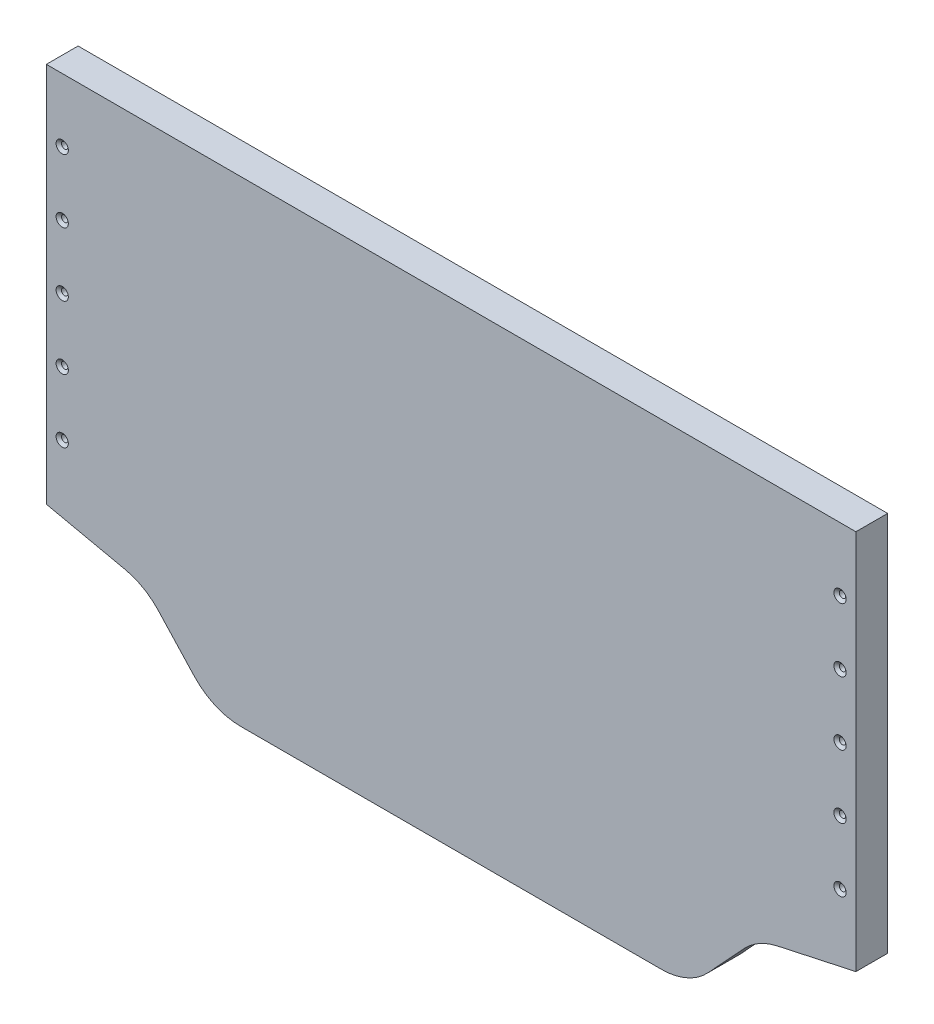
ISO-10303-21;
HEADER;
FILE_DESCRIPTION(('STEP AP214'),'2;1');
FILE_NAME('part.step','',(''),(''),'','','');
FILE_SCHEMA(('AUTOMOTIVE_DESIGN { 1 0 10303 214 1 1 1 1 }'));
ENDSEC;
DATA;
#1=APPLICATION_CONTEXT('core data for automotive mechanical design processes');
#2=APPLICATION_PROTOCOL_DEFINITION('international standard','automotive_design',2000,#1);
#3=PRODUCT_CONTEXT('',#1,'mechanical');
#4=PRODUCT('Part','Part','',(#3));
#5=PRODUCT_RELATED_PRODUCT_CATEGORY('part','',(#4));
#6=PRODUCT_DEFINITION_FORMATION('','',#4);
#7=PRODUCT_DEFINITION_CONTEXT('part definition',#1,'design');
#8=PRODUCT_DEFINITION('design','',#6,#7);
#9=PRODUCT_DEFINITION_SHAPE('','',#8);
#10=(LENGTH_UNIT() NAMED_UNIT(*) SI_UNIT(.MILLI.,.METRE.));
#11=(NAMED_UNIT(*) PLANE_ANGLE_UNIT() SI_UNIT($,.RADIAN.));
#12=(NAMED_UNIT(*) SI_UNIT($,.STERADIAN.) SOLID_ANGLE_UNIT());
#13=UNCERTAINTY_MEASURE_WITH_UNIT(LENGTH_MEASURE(1.E-05),#10,'distance_accuracy_value','');
#14=(GEOMETRIC_REPRESENTATION_CONTEXT(3) GLOBAL_UNCERTAINTY_ASSIGNED_CONTEXT((#13)) GLOBAL_UNIT_ASSIGNED_CONTEXT((#10,
#11,#12)) REPRESENTATION_CONTEXT('',''));
#15=CARTESIAN_POINT('',(0.,0.,0.));
#16=DIRECTION('',(0.,0.,1.));
#17=DIRECTION('',(1.,0.,0.));
#18=AXIS2_PLACEMENT_3D('',#15,#16,#17);
#19=CARTESIAN_POINT('',(-323.85,76.2,25.4));
#20=DIRECTION('',(1.,0.,0.));
#21=DIRECTION('',(0.,0.,-1.));
#22=AXIS2_PLACEMENT_3D('',#19,#20,#21);
#23=PLANE('',#22);
#24=DIRECTION('',(0.,-1.,0.));
#25=VECTOR('',#24,1.);
#26=CARTESIAN_POINT('',(-323.85,76.2,0.));
#27=LINE('',#26,#25);
#28=CARTESIAN_POINT('',(-323.85,381.,0.));
#29=VERTEX_POINT('',#28);
#30=CARTESIAN_POINT('',(-323.85,76.2,0.));
#31=VERTEX_POINT('',#30);
#32=EDGE_CURVE('E147',#29,#31,#27,.T.);
#33=ORIENTED_EDGE('',*,*,#32,.T.);
#34=DIRECTION('',(0.,0.,-1.));
#35=VECTOR('',#34,1.);
#36=CARTESIAN_POINT('',(-323.85,76.2,25.4));
#37=LINE('',#36,#35);
#38=CARTESIAN_POINT('',(-323.85,76.2,25.4));
#39=VERTEX_POINT('',#38);
#40=EDGE_CURVE('E129',#39,#31,#37,.T.);
#41=ORIENTED_EDGE('',*,*,#40,.F.);
#42=DIRECTION('',(0.,-1.,0.));
#43=VECTOR('',#42,1.);
#44=CARTESIAN_POINT('',(-323.85,76.2,25.4));
#45=LINE('',#44,#43);
#46=CARTESIAN_POINT('',(-323.85,381.,25.4));
#47=VERTEX_POINT('',#46);
#48=EDGE_CURVE('E134',#47,#39,#45,.T.);
#49=ORIENTED_EDGE('',*,*,#48,.F.);
#50=DIRECTION('',(0.,0.,-1.));
#51=VECTOR('',#50,1.);
#52=CARTESIAN_POINT('',(-323.85,381.,25.4));
#53=LINE('',#52,#51);
#54=EDGE_CURVE('E282',#47,#29,#53,.T.);
#55=ORIENTED_EDGE('',*,*,#54,.T.);
#56=EDGE_LOOP('',(#33,#41,#49,#55));
#57=FACE_BOUND('',#56,.T.);
#58=ADVANCED_FACE('F34',(#57),#23,.F.);
#59=CARTESIAN_POINT('',(-245.162116143711,59.1225467485061,25.4));
#60=DIRECTION('',(0.212090367220507,0.977250058138791,0.));
#61=DIRECTION('',(-0.977250058138791,0.212090367220507,0.));
#62=AXIS2_PLACEMENT_3D('',#59,#60,#61);
#63=PLANE('',#62);
#64=DIRECTION('',(0.977250058138791,-0.212090367220507,0.));
#65=VECTOR('',#64,1.);
#66=CARTESIAN_POINT('',(-245.162116143711,59.1225467485061,0.));
#67=LINE('',#66,#65);
#68=CARTESIAN_POINT('',(-260.814904739675,62.5196360131163,0.));
#69=VERTEX_POINT('',#68);
#70=EDGE_CURVE('E284',#31,#69,#67,.T.);
#71=ORIENTED_EDGE('',*,*,#70,.T.);
#72=DIRECTION('',(0.,0.,-1.));
#73=VECTOR('',#72,1.);
#74=CARTESIAN_POINT('',(-260.814904739675,62.5196360131163,25.4));
#75=LINE('',#74,#73);
#76=CARTESIAN_POINT('',(-260.814904739675,62.5196360131163,25.4));
#77=VERTEX_POINT('',#76);
#78=EDGE_CURVE('E132',#69,#77,#75,.F.);
#79=ORIENTED_EDGE('',*,*,#78,.T.);
#80=DIRECTION('',(0.977250058138791,-0.212090367220507,0.));
#81=VECTOR('',#80,1.);
#82=CARTESIAN_POINT('',(-245.162116143711,59.1225467485061,25.4));
#83=LINE('',#82,#81);
#84=EDGE_CURVE('E124',#39,#77,#83,.T.);
#85=ORIENTED_EDGE('',*,*,#84,.F.);
#86=ORIENTED_EDGE('',*,*,#40,.T.);
#87=EDGE_LOOP('',(#71,#79,#85,#86));
#88=FACE_BOUND('',#87,.T.);
#89=ADVANCED_FACE('F127',(#88),#63,.F.);
#90=CARTESIAN_POINT('',(-245.162116143711,59.1225467485061,25.4));
#91=DIRECTION('',(0.734261863653778,0.678866345891207,0.));
#92=DIRECTION('',(-0.678866345891207,0.734261863653778,0.));
#93=AXIS2_PLACEMENT_3D('',#90,#91,#92);
#94=PLANE('',#93);
#95=DIRECTION('',(0.678866345891207,-0.734261863653778,0.));
#96=VECTOR('',#95,1.);
#97=CARTESIAN_POINT('',(-245.162116143711,59.1225467485061,0.));
#98=LINE('',#97,#96);
#99=CARTESIAN_POINT('',(-234.288592720865,47.361743430939,0.));
#100=VERTEX_POINT('',#99);
#101=CARTESIAN_POINT('',(-205.582830156142,16.3135896287267,0.));
#102=VERTEX_POINT('',#101);
#103=EDGE_CURVE('E286',#100,#102,#98,.T.);
#104=ORIENTED_EDGE('',*,*,#103,.T.);
#105=DIRECTION('',(0.,0.,-1.));
#106=VECTOR('',#105,1.);
#107=CARTESIAN_POINT('',(-205.582830156142,16.3135896287267,25.4));
#108=LINE('',#107,#106);
#109=CARTESIAN_POINT('',(-205.582830156142,16.3135896287267,25.4));
#110=VERTEX_POINT('',#109);
#111=EDGE_CURVE('E51',#102,#110,#108,.F.);
#112=ORIENTED_EDGE('',*,*,#111,.T.);
#113=DIRECTION('',(0.678866345891207,-0.734261863653778,0.));
#114=VECTOR('',#113,1.);
#115=CARTESIAN_POINT('',(-245.162116143711,59.1225467485061,25.4));
#116=LINE('',#115,#114);
#117=CARTESIAN_POINT('',(-234.288592720865,47.361743430939,25.4));
#118=VERTEX_POINT('',#117);
#119=EDGE_CURVE('E133',#118,#110,#116,.T.);
#120=ORIENTED_EDGE('',*,*,#119,.F.);
#121=DIRECTION('',(0.,0.,-1.));
#122=VECTOR('',#121,1.);
#123=CARTESIAN_POINT('',(-234.288592720865,47.361743430939,0.));
#124=LINE('',#123,#122);
#125=EDGE_CURVE('E176',#118,#100,#124,.T.);
#126=ORIENTED_EDGE('',*,*,#125,.T.);
#127=EDGE_LOOP('',(#104,#112,#120,#126));
#128=FACE_BOUND('',#127,.T.);
#129=ADVANCED_FACE('F314',(#128),#94,.F.);
#130=CARTESIAN_POINT('',(-190.5,0.,25.4));
#131=DIRECTION('',(0.,1.,0.));
#132=DIRECTION('',(-1.,0.,0.));
#133=AXIS2_PLACEMENT_3D('',#130,#131,#132);
#134=PLANE('',#133);
#135=DIRECTION('',(1.,0.,0.));
#136=VECTOR('',#135,1.);
#137=CARTESIAN_POINT('',(-190.5,0.,0.));
#138=LINE('',#137,#136);
#139=CARTESIAN_POINT('',(-168.28232748253,0.,0.));
#140=VERTEX_POINT('',#139);
#141=CARTESIAN_POINT('',(168.28232748253,0.,0.));
#142=VERTEX_POINT('',#141);
#143=EDGE_CURVE('E288',#140,#142,#138,.T.);
#144=ORIENTED_EDGE('',*,*,#143,.T.);
#145=DIRECTION('',(0.,0.,-1.));
#146=VECTOR('',#145,1.);
#147=CARTESIAN_POINT('',(168.28232748253,0.,25.4));
#148=LINE('',#147,#146);
#149=CARTESIAN_POINT('',(168.28232748253,0.,25.4));
#150=VERTEX_POINT('',#149);
#151=EDGE_CURVE('E170',#142,#150,#148,.F.);
#152=ORIENTED_EDGE('',*,*,#151,.T.);
#153=DIRECTION('',(1.,0.,0.));
#154=VECTOR('',#153,1.);
#155=CARTESIAN_POINT('',(-190.5,0.,25.4));
#156=LINE('',#155,#154);
#157=CARTESIAN_POINT('',(-168.28232748253,0.,25.4));
#158=VERTEX_POINT('',#157);
#159=EDGE_CURVE('E272',#158,#150,#156,.T.);
#160=ORIENTED_EDGE('',*,*,#159,.F.);
#161=DIRECTION('',(0.,0.,-1.));
#162=VECTOR('',#161,1.);
#163=CARTESIAN_POINT('',(-168.28232748253,0.,25.4));
#164=LINE('',#163,#162);
#165=EDGE_CURVE('E167',#158,#140,#164,.T.);
#166=ORIENTED_EDGE('',*,*,#165,.T.);
#167=EDGE_LOOP('',(#144,#152,#160,#166));
#168=FACE_BOUND('',#167,.T.);
#169=ADVANCED_FACE('F322',(#168),#134,.F.);
#170=CARTESIAN_POINT('',(245.162116143711,59.1225467485061,25.4));
#171=DIRECTION('',(-0.734261863653778,0.678866345891207,0.));
#172=DIRECTION('',(-0.678866345891207,-0.734261863653778,0.));
#173=AXIS2_PLACEMENT_3D('',#170,#171,#172);
#174=PLANE('',#173);
#175=DIRECTION('',(0.678866345891207,0.734261863653778,0.));
#176=VECTOR('',#175,1.);
#177=CARTESIAN_POINT('',(245.162116143711,59.1225467485061,0.));
#178=LINE('',#177,#176);
#179=CARTESIAN_POINT('',(205.582830156142,16.3135896287267,0.));
#180=VERTEX_POINT('',#179);
#181=CARTESIAN_POINT('',(234.288592720865,47.361743430939,0.));
#182=VERTEX_POINT('',#181);
#183=EDGE_CURVE('E291',#180,#182,#178,.T.);
#184=ORIENTED_EDGE('',*,*,#183,.T.);
#185=DIRECTION('',(0.,0.,-1.));
#186=VECTOR('',#185,1.);
#187=CARTESIAN_POINT('',(234.288592720865,47.361743430939,25.4));
#188=LINE('',#187,#186);
#189=CARTESIAN_POINT('',(234.288592720865,47.361743430939,25.4));
#190=VERTEX_POINT('',#189);
#191=EDGE_CURVE('E161',#182,#190,#188,.F.);
#192=ORIENTED_EDGE('',*,*,#191,.T.);
#193=DIRECTION('',(0.678866345891207,0.734261863653778,0.));
#194=VECTOR('',#193,1.);
#195=CARTESIAN_POINT('',(245.162116143711,59.1225467485061,25.4));
#196=LINE('',#195,#194);
#197=CARTESIAN_POINT('',(205.582830156142,16.3135896287267,25.4));
#198=VERTEX_POINT('',#197);
#199=EDGE_CURVE('E274',#198,#190,#196,.T.);
#200=ORIENTED_EDGE('',*,*,#199,.F.);
#201=DIRECTION('',(0.,0.,-1.));
#202=VECTOR('',#201,1.);
#203=CARTESIAN_POINT('',(205.582830156142,16.3135896287267,25.4));
#204=LINE('',#203,#202);
#205=EDGE_CURVE('E152',#198,#180,#204,.T.);
#206=ORIENTED_EDGE('',*,*,#205,.T.);
#207=EDGE_LOOP('',(#184,#192,#200,#206));
#208=FACE_BOUND('',#207,.T.);
#209=ADVANCED_FACE('F330',(#208),#174,.F.);
#210=CARTESIAN_POINT('',(245.162116143711,59.1225467485061,25.4));
#211=DIRECTION('',(-0.212090367220507,0.977250058138791,0.));
#212=DIRECTION('',(-0.977250058138791,-0.212090367220507,0.));
#213=AXIS2_PLACEMENT_3D('',#210,#211,#212);
#214=PLANE('',#213);
#215=DIRECTION('',(0.977250058138791,0.212090367220507,0.));
#216=VECTOR('',#215,1.);
#217=CARTESIAN_POINT('',(245.162116143711,59.1225467485061,25.4));
#218=LINE('',#217,#216);
#219=CARTESIAN_POINT('',(260.814904739675,62.5196360131163,25.4));
#220=VERTEX_POINT('',#219);
#221=CARTESIAN_POINT('',(323.85,76.2,25.4));
#222=VERTEX_POINT('',#221);
#223=EDGE_CURVE('E277',#220,#222,#218,.T.);
#224=ORIENTED_EDGE('',*,*,#223,.F.);
#225=DIRECTION('',(0.,0.,-1.));
#226=VECTOR('',#225,1.);
#227=CARTESIAN_POINT('',(260.814904739675,62.5196360131163,0.));
#228=LINE('',#227,#226);
#229=CARTESIAN_POINT('',(260.814904739675,62.5196360131163,0.));
#230=VERTEX_POINT('',#229);
#231=EDGE_CURVE('E148',#220,#230,#228,.T.);
#232=ORIENTED_EDGE('',*,*,#231,.T.);
#233=DIRECTION('',(0.977250058138791,0.212090367220507,0.));
#234=VECTOR('',#233,1.);
#235=CARTESIAN_POINT('',(245.162116143711,59.1225467485061,0.));
#236=LINE('',#235,#234);
#237=CARTESIAN_POINT('',(323.85,76.2,0.));
#238=VERTEX_POINT('',#237);
#239=EDGE_CURVE('E294',#230,#238,#236,.T.);
#240=ORIENTED_EDGE('',*,*,#239,.T.);
#241=DIRECTION('',(0.,0.,-1.));
#242=VECTOR('',#241,1.);
#243=CARTESIAN_POINT('',(323.85,76.2,25.4));
#244=LINE('',#243,#242);
#245=EDGE_CURVE('E149',#222,#238,#244,.T.);
#246=ORIENTED_EDGE('',*,*,#245,.F.);
#247=EDGE_LOOP('',(#224,#232,#240,#246));
#248=FACE_BOUND('',#247,.T.);
#249=ADVANCED_FACE('F338',(#248),#214,.F.);
#250=CARTESIAN_POINT('',(323.85,76.2,25.4));
#251=DIRECTION('',(-1.,0.,0.));
#252=DIRECTION('',(0.,0.,1.));
#253=AXIS2_PLACEMENT_3D('',#250,#251,#252);
#254=PLANE('',#253);
#255=DIRECTION('',(0.,1.,0.));
#256=VECTOR('',#255,1.);
#257=CARTESIAN_POINT('',(323.85,76.2,0.));
#258=LINE('',#257,#256);
#259=CARTESIAN_POINT('',(323.85,381.,0.));
#260=VERTEX_POINT('',#259);
#261=EDGE_CURVE('E296',#238,#260,#258,.T.);
#262=ORIENTED_EDGE('',*,*,#261,.T.);
#263=DIRECTION('',(0.,0.,-1.));
#264=VECTOR('',#263,1.);
#265=CARTESIAN_POINT('',(323.85,381.,25.4));
#266=LINE('',#265,#264);
#267=CARTESIAN_POINT('',(323.85,381.,25.4));
#268=VERTEX_POINT('',#267);
#269=EDGE_CURVE('E155',#268,#260,#266,.T.);
#270=ORIENTED_EDGE('',*,*,#269,.F.);
#271=DIRECTION('',(0.,1.,0.));
#272=VECTOR('',#271,1.);
#273=CARTESIAN_POINT('',(323.85,76.2,25.4));
#274=LINE('',#273,#272);
#275=EDGE_CURVE('E279',#222,#268,#274,.T.);
#276=ORIENTED_EDGE('',*,*,#275,.F.);
#277=ORIENTED_EDGE('',*,*,#245,.T.);
#278=EDGE_LOOP('',(#262,#270,#276,#277));
#279=FACE_BOUND('',#278,.T.);
#280=ADVANCED_FACE('F340',(#279),#254,.F.);
#281=CARTESIAN_POINT('',(323.85,381.,25.4));
#282=DIRECTION('',(0.,-1.,0.));
#283=DIRECTION('',(1.,0.,0.));
#284=AXIS2_PLACEMENT_3D('',#281,#282,#283);
#285=PLANE('',#284);
#286=DIRECTION('',(-1.,0.,0.));
#287=VECTOR('',#286,1.);
#288=CARTESIAN_POINT('',(323.85,381.,0.));
#289=LINE('',#288,#287);
#290=EDGE_CURVE('E144',#260,#29,#289,.T.);
#291=ORIENTED_EDGE('',*,*,#290,.T.);
#292=ORIENTED_EDGE('',*,*,#54,.F.);
#293=DIRECTION('',(-1.,0.,0.));
#294=VECTOR('',#293,1.);
#295=CARTESIAN_POINT('',(323.85,381.,25.4));
#296=LINE('',#295,#294);
#297=EDGE_CURVE('E140',#268,#47,#296,.T.);
#298=ORIENTED_EDGE('',*,*,#297,.F.);
#299=ORIENTED_EDGE('',*,*,#269,.T.);
#300=EDGE_LOOP('',(#291,#292,#298,#299));
#301=FACE_BOUND('',#300,.T.);
#302=ADVANCED_FACE('F303',(#301),#285,.F.);
#303=CARTESIAN_POINT('',(0.,0.,25.4));
#304=DIRECTION('',(0.,0.,1.));
#305=DIRECTION('',(1.,0.,0.));
#306=AXIS2_PLACEMENT_3D('',#303,#304,#305);
#307=PLANE('',#306);
#308=CARTESIAN_POINT('',(-311.15,330.2,25.4));
#309=DIRECTION('',(0.,0.,1.));
#310=DIRECTION('',(1.,0.,0.));
#311=AXIS2_PLACEMENT_3D('',#308,#309,#310);
#312=CIRCLE('',#311,4.88949999999999);
#313=CARTESIAN_POINT('',(-306.2605,330.2,25.4));
#314=VERTEX_POINT('',#313);
#315=EDGE_CURVE('E485',#314,#314,#312,.T.);
#316=ORIENTED_EDGE('',*,*,#315,.F.);
#317=EDGE_LOOP('',(#316));
#318=FACE_BOUND('',#317,.T.);
#319=CARTESIAN_POINT('',(-311.149999999999,279.4,25.4));
#320=DIRECTION('',(0.,0.,1.));
#321=DIRECTION('',(1.,0.,0.));
#322=AXIS2_PLACEMENT_3D('',#319,#320,#321);
#323=CIRCLE('',#322,4.88949999999999);
#324=CARTESIAN_POINT('',(-306.260499999999,279.4,25.4));
#325=VERTEX_POINT('',#324);
#326=EDGE_CURVE('E233',#325,#325,#323,.T.);
#327=ORIENTED_EDGE('',*,*,#326,.F.);
#328=EDGE_LOOP('',(#327));
#329=FACE_BOUND('',#328,.T.);
#330=CARTESIAN_POINT('',(-311.149999999999,228.6,25.4));
#331=DIRECTION('',(0.,0.,1.));
#332=DIRECTION('',(1.,0.,0.));
#333=AXIS2_PLACEMENT_3D('',#330,#331,#332);
#334=CIRCLE('',#333,4.88949999999999);
#335=CARTESIAN_POINT('',(-306.260499999999,228.6,25.4));
#336=VERTEX_POINT('',#335);
#337=EDGE_CURVE('E226',#336,#336,#334,.T.);
#338=ORIENTED_EDGE('',*,*,#337,.F.);
#339=EDGE_LOOP('',(#338));
#340=FACE_BOUND('',#339,.T.);
#341=CARTESIAN_POINT('',(-311.149999999998,177.8,25.4));
#342=DIRECTION('',(0.,0.,1.));
#343=DIRECTION('',(1.,0.,0.));
#344=AXIS2_PLACEMENT_3D('',#341,#342,#343);
#345=CIRCLE('',#344,4.88949999999999);
#346=CARTESIAN_POINT('',(-306.260499999998,177.8,25.4));
#347=VERTEX_POINT('',#346);
#348=EDGE_CURVE('E222',#347,#347,#345,.T.);
#349=ORIENTED_EDGE('',*,*,#348,.F.);
#350=EDGE_LOOP('',(#349));
#351=FACE_BOUND('',#350,.T.);
#352=CARTESIAN_POINT('',(-311.149999999998,127.,25.4));
#353=DIRECTION('',(0.,0.,1.));
#354=DIRECTION('',(1.,0.,0.));
#355=AXIS2_PLACEMENT_3D('',#352,#353,#354);
#356=CIRCLE('',#355,4.88949999999999);
#357=CARTESIAN_POINT('',(-306.260499999998,127.,25.4));
#358=VERTEX_POINT('',#357);
#359=EDGE_CURVE('E218',#358,#358,#356,.T.);
#360=ORIENTED_EDGE('',*,*,#359,.F.);
#361=EDGE_LOOP('',(#360));
#362=FACE_BOUND('',#361,.T.);
#363=CARTESIAN_POINT('',(311.15,330.2,25.4));
#364=DIRECTION('',(0.,0.,1.));
#365=DIRECTION('',(1.,0.,0.));
#366=AXIS2_PLACEMENT_3D('',#363,#364,#365);
#367=CIRCLE('',#366,4.88949999999999);
#368=CARTESIAN_POINT('',(316.0395,330.2,25.4));
#369=VERTEX_POINT('',#368);
#370=EDGE_CURVE('E213',#369,#369,#367,.T.);
#371=ORIENTED_EDGE('',*,*,#370,.F.);
#372=EDGE_LOOP('',(#371));
#373=FACE_BOUND('',#372,.T.);
#374=CARTESIAN_POINT('',(311.149999999999,279.4,25.4));
#375=DIRECTION('',(0.,0.,1.));
#376=DIRECTION('',(1.,0.,0.));
#377=AXIS2_PLACEMENT_3D('',#374,#375,#376);
#378=CIRCLE('',#377,4.88949999999999);
#379=CARTESIAN_POINT('',(316.039499999999,279.4,25.4));
#380=VERTEX_POINT('',#379);
#381=EDGE_CURVE('E208',#380,#380,#378,.T.);
#382=ORIENTED_EDGE('',*,*,#381,.F.);
#383=EDGE_LOOP('',(#382));
#384=FACE_BOUND('',#383,.T.);
#385=CARTESIAN_POINT('',(311.149999999999,228.6,25.4));
#386=DIRECTION('',(0.,0.,1.));
#387=DIRECTION('',(1.,0.,0.));
#388=AXIS2_PLACEMENT_3D('',#385,#386,#387);
#389=CIRCLE('',#388,4.88949999999999);
#390=CARTESIAN_POINT('',(316.039499999999,228.6,25.4));
#391=VERTEX_POINT('',#390);
#392=EDGE_CURVE('E203',#391,#391,#389,.T.);
#393=ORIENTED_EDGE('',*,*,#392,.F.);
#394=EDGE_LOOP('',(#393));
#395=FACE_BOUND('',#394,.T.);
#396=CARTESIAN_POINT('',(311.149999999998,177.8,25.4));
#397=DIRECTION('',(0.,0.,1.));
#398=DIRECTION('',(1.,0.,0.));
#399=AXIS2_PLACEMENT_3D('',#396,#397,#398);
#400=CIRCLE('',#399,4.88949999999999);
#401=CARTESIAN_POINT('',(316.039499999998,177.8,25.4));
#402=VERTEX_POINT('',#401);
#403=EDGE_CURVE('E198',#402,#402,#400,.T.);
#404=ORIENTED_EDGE('',*,*,#403,.F.);
#405=EDGE_LOOP('',(#404));
#406=FACE_BOUND('',#405,.T.);
#407=CARTESIAN_POINT('',(311.149999999998,127.,25.4));
#408=DIRECTION('',(0.,0.,1.));
#409=DIRECTION('',(1.,0.,0.));
#410=AXIS2_PLACEMENT_3D('',#407,#408,#409);
#411=CIRCLE('',#410,4.88949999999999);
#412=CARTESIAN_POINT('',(316.039499999998,127.,25.4));
#413=VERTEX_POINT('',#412);
#414=EDGE_CURVE('E193',#413,#413,#411,.T.);
#415=ORIENTED_EDGE('',*,*,#414,.F.);
#416=EDGE_LOOP('',(#415));
#417=FACE_BOUND('',#416,.T.);
#418=ORIENTED_EDGE('',*,*,#159,.T.);
#419=CARTESIAN_POINT('',(168.28232748253,50.8,25.4));
#420=DIRECTION('',(0.,0.,1.));
#421=DIRECTION('',(1.,0.,0.));
#422=AXIS2_PLACEMENT_3D('',#419,#420,#421);
#423=CIRCLE('',#422,50.8);
#424=EDGE_CURVE('E174',#150,#198,#423,.T.);
#425=ORIENTED_EDGE('',*,*,#424,.T.);
#426=ORIENTED_EDGE('',*,*,#199,.T.);
#427=CARTESIAN_POINT('',(271.589095394477,12.8753330596657,25.4));
#428=DIRECTION('',(0.,0.,1.));
#429=DIRECTION('',(1.,0.,0.));
#430=AXIS2_PLACEMENT_3D('',#427,#428,#429);
#431=CIRCLE('',#430,50.8);
#432=EDGE_CURVE('E183',#190,#220,#431,.F.);
#433=ORIENTED_EDGE('',*,*,#432,.T.);
#434=ORIENTED_EDGE('',*,*,#223,.T.);
#435=ORIENTED_EDGE('',*,*,#275,.T.);
#436=ORIENTED_EDGE('',*,*,#297,.T.);
#437=ORIENTED_EDGE('',*,*,#48,.T.);
#438=ORIENTED_EDGE('',*,*,#84,.T.);
#439=CARTESIAN_POINT('',(-271.589095394477,12.8753330596657,25.4));
#440=DIRECTION('',(0.,0.,1.));
#441=DIRECTION('',(1.,0.,0.));
#442=AXIS2_PLACEMENT_3D('',#439,#440,#441);
#443=CIRCLE('',#442,50.8);
#444=EDGE_CURVE('E11',#77,#118,#443,.F.);
#445=ORIENTED_EDGE('',*,*,#444,.T.);
#446=ORIENTED_EDGE('',*,*,#119,.T.);
#447=CARTESIAN_POINT('',(-168.28232748253,50.8,25.4));
#448=DIRECTION('',(0.,0.,1.));
#449=DIRECTION('',(1.,0.,0.));
#450=AXIS2_PLACEMENT_3D('',#447,#448,#449);
#451=CIRCLE('',#450,50.8);
#452=EDGE_CURVE('E172',#110,#158,#451,.T.);
#453=ORIENTED_EDGE('',*,*,#452,.T.);
#454=EDGE_LOOP('',(#418,#425,#426,#433,#434,#435,#436,#437,#438,#445,#446,#453));
#455=FACE_BOUND('',#454,.T.);
#456=ADVANCED_FACE('F138',(#318,#329,#340,#351,#362,#373,#384,#395,#406,#417,#455),#307,.T.);
#457=CARTESIAN_POINT('',(0.,0.,0.));
#458=DIRECTION('',(0.,0.,1.));
#459=DIRECTION('',(1.,0.,0.));
#460=AXIS2_PLACEMENT_3D('',#457,#458,#459);
#461=PLANE('',#460);
#462=CARTESIAN_POINT('',(-311.15,330.2,0.));
#463=DIRECTION('',(0.,0.,1.));
#464=DIRECTION('',(1.,0.,0.));
#465=AXIS2_PLACEMENT_3D('',#462,#463,#464);
#466=CIRCLE('',#465,2.55269999999999);
#467=CARTESIAN_POINT('',(-308.5973,330.2,0.));
#468=VERTEX_POINT('',#467);
#469=EDGE_CURVE('E38',#468,#468,#466,.T.);
#470=ORIENTED_EDGE('',*,*,#469,.T.);
#471=EDGE_LOOP('',(#470));
#472=FACE_BOUND('',#471,.T.);
#473=CARTESIAN_POINT('',(-311.149999999999,279.4,0.));
#474=DIRECTION('',(0.,0.,1.));
#475=DIRECTION('',(1.,0.,0.));
#476=AXIS2_PLACEMENT_3D('',#473,#474,#475);
#477=CIRCLE('',#476,2.55269999999999);
#478=CARTESIAN_POINT('',(-308.597299999999,279.4,0.));
#479=VERTEX_POINT('',#478);
#480=EDGE_CURVE('E224',#479,#479,#477,.T.);
#481=ORIENTED_EDGE('',*,*,#480,.T.);
#482=EDGE_LOOP('',(#481));
#483=FACE_BOUND('',#482,.T.);
#484=CARTESIAN_POINT('',(-311.149999999999,228.6,0.));
#485=DIRECTION('',(0.,0.,1.));
#486=DIRECTION('',(1.,0.,0.));
#487=AXIS2_PLACEMENT_3D('',#484,#485,#486);
#488=CIRCLE('',#487,2.55269999999999);
#489=CARTESIAN_POINT('',(-308.597299999999,228.6,0.));
#490=VERTEX_POINT('',#489);
#491=EDGE_CURVE('E220',#490,#490,#488,.T.);
#492=ORIENTED_EDGE('',*,*,#491,.T.);
#493=EDGE_LOOP('',(#492));
#494=FACE_BOUND('',#493,.T.);
#495=CARTESIAN_POINT('',(-311.149999999998,177.8,0.));
#496=DIRECTION('',(0.,0.,1.));
#497=DIRECTION('',(1.,0.,0.));
#498=AXIS2_PLACEMENT_3D('',#495,#496,#497);
#499=CIRCLE('',#498,2.55269999999999);
#500=CARTESIAN_POINT('',(-308.597299999998,177.8,0.));
#501=VERTEX_POINT('',#500);
#502=EDGE_CURVE('E215',#501,#501,#499,.T.);
#503=ORIENTED_EDGE('',*,*,#502,.T.);
#504=EDGE_LOOP('',(#503));
#505=FACE_BOUND('',#504,.T.);
#506=CARTESIAN_POINT('',(-311.149999999998,127.,0.));
#507=DIRECTION('',(0.,0.,1.));
#508=DIRECTION('',(1.,0.,0.));
#509=AXIS2_PLACEMENT_3D('',#506,#507,#508);
#510=CIRCLE('',#509,2.55269999999999);
#511=CARTESIAN_POINT('',(-308.597299999998,127.,0.));
#512=VERTEX_POINT('',#511);
#513=EDGE_CURVE('E210',#512,#512,#510,.T.);
#514=ORIENTED_EDGE('',*,*,#513,.T.);
#515=EDGE_LOOP('',(#514));
#516=FACE_BOUND('',#515,.T.);
#517=CARTESIAN_POINT('',(311.15,330.2,0.));
#518=DIRECTION('',(0.,0.,1.));
#519=DIRECTION('',(1.,0.,0.));
#520=AXIS2_PLACEMENT_3D('',#517,#518,#519);
#521=CIRCLE('',#520,2.55269999999999);
#522=CARTESIAN_POINT('',(313.7027,330.2,0.));
#523=VERTEX_POINT('',#522);
#524=EDGE_CURVE('E205',#523,#523,#521,.T.);
#525=ORIENTED_EDGE('',*,*,#524,.T.);
#526=EDGE_LOOP('',(#525));
#527=FACE_BOUND('',#526,.T.);
#528=CARTESIAN_POINT('',(311.149999999999,279.4,0.));
#529=DIRECTION('',(0.,0.,1.));
#530=DIRECTION('',(1.,0.,0.));
#531=AXIS2_PLACEMENT_3D('',#528,#529,#530);
#532=CIRCLE('',#531,2.55269999999999);
#533=CARTESIAN_POINT('',(313.702699999999,279.4,0.));
#534=VERTEX_POINT('',#533);
#535=EDGE_CURVE('E200',#534,#534,#532,.T.);
#536=ORIENTED_EDGE('',*,*,#535,.T.);
#537=EDGE_LOOP('',(#536));
#538=FACE_BOUND('',#537,.T.);
#539=CARTESIAN_POINT('',(311.149999999999,228.6,0.));
#540=DIRECTION('',(0.,0.,1.));
#541=DIRECTION('',(1.,0.,0.));
#542=AXIS2_PLACEMENT_3D('',#539,#540,#541);
#543=CIRCLE('',#542,2.55269999999999);
#544=CARTESIAN_POINT('',(313.702699999999,228.6,0.));
#545=VERTEX_POINT('',#544);
#546=EDGE_CURVE('E195',#545,#545,#543,.T.);
#547=ORIENTED_EDGE('',*,*,#546,.T.);
#548=EDGE_LOOP('',(#547));
#549=FACE_BOUND('',#548,.T.);
#550=CARTESIAN_POINT('',(311.149999999998,177.8,0.));
#551=DIRECTION('',(0.,0.,1.));
#552=DIRECTION('',(1.,0.,0.));
#553=AXIS2_PLACEMENT_3D('',#550,#551,#552);
#554=CIRCLE('',#553,2.55269999999999);
#555=CARTESIAN_POINT('',(313.702699999998,177.8,0.));
#556=VERTEX_POINT('',#555);
#557=EDGE_CURVE('E190',#556,#556,#554,.T.);
#558=ORIENTED_EDGE('',*,*,#557,.T.);
#559=EDGE_LOOP('',(#558));
#560=FACE_BOUND('',#559,.T.);
#561=CARTESIAN_POINT('',(311.149999999998,127.,0.));
#562=DIRECTION('',(0.,0.,1.));
#563=DIRECTION('',(1.,0.,0.));
#564=AXIS2_PLACEMENT_3D('',#561,#562,#563);
#565=CIRCLE('',#564,2.55269999999999);
#566=CARTESIAN_POINT('',(313.702699999998,127.,0.));
#567=VERTEX_POINT('',#566);
#568=EDGE_CURVE('E186',#567,#567,#565,.T.);
#569=ORIENTED_EDGE('',*,*,#568,.T.);
#570=EDGE_LOOP('',(#569));
#571=FACE_BOUND('',#570,.T.);
#572=ORIENTED_EDGE('',*,*,#183,.F.);
#573=CARTESIAN_POINT('',(168.28232748253,50.8,0.));
#574=DIRECTION('',(0.,0.,1.));
#575=DIRECTION('',(1.,0.,0.));
#576=AXIS2_PLACEMENT_3D('',#573,#574,#575);
#577=CIRCLE('',#576,50.8);
#578=EDGE_CURVE('E165',#180,#142,#577,.F.);
#579=ORIENTED_EDGE('',*,*,#578,.T.);
#580=ORIENTED_EDGE('',*,*,#143,.F.);
#581=CARTESIAN_POINT('',(-168.28232748253,50.8,0.));
#582=DIRECTION('',(0.,0.,1.));
#583=DIRECTION('',(1.,0.,0.));
#584=AXIS2_PLACEMENT_3D('',#581,#582,#583);
#585=CIRCLE('',#584,50.8);
#586=EDGE_CURVE('E163',#140,#102,#585,.F.);
#587=ORIENTED_EDGE('',*,*,#586,.T.);
#588=ORIENTED_EDGE('',*,*,#103,.F.);
#589=CARTESIAN_POINT('',(-271.589095394477,12.8753330596657,0.));
#590=DIRECTION('',(0.,0.,1.));
#591=DIRECTION('',(1.,0.,0.));
#592=AXIS2_PLACEMENT_3D('',#589,#590,#591);
#593=CIRCLE('',#592,50.8);
#594=EDGE_CURVE('E43',#100,#69,#593,.T.);
#595=ORIENTED_EDGE('',*,*,#594,.T.);
#596=ORIENTED_EDGE('',*,*,#70,.F.);
#597=ORIENTED_EDGE('',*,*,#32,.F.);
#598=ORIENTED_EDGE('',*,*,#290,.F.);
#599=ORIENTED_EDGE('',*,*,#261,.F.);
#600=ORIENTED_EDGE('',*,*,#239,.F.);
#601=CARTESIAN_POINT('',(271.589095394477,12.8753330596657,0.));
#602=DIRECTION('',(0.,0.,1.));
#603=DIRECTION('',(1.,0.,0.));
#604=AXIS2_PLACEMENT_3D('',#601,#602,#603);
#605=CIRCLE('',#604,50.8);
#606=EDGE_CURVE('E181',#230,#182,#605,.T.);
#607=ORIENTED_EDGE('',*,*,#606,.T.);
#608=EDGE_LOOP('',(#572,#579,#580,#587,#588,#595,#596,#597,#598,#599,#600,#607));
#609=FACE_BOUND('',#608,.T.);
#610=ADVANCED_FACE('F309',(#472,#483,#494,#505,#516,#527,#538,#549,#560,#571,#609),#461,.F.);
#611=CARTESIAN_POINT('',(271.589095394477,12.8753330596657,25.4));
#612=DIRECTION('',(0.,0.,1.));
#613=DIRECTION('',(1.,0.,0.));
#614=AXIS2_PLACEMENT_3D('',#611,#612,#613);
#615=CYLINDRICAL_SURFACE('',#614,50.8);
#616=ORIENTED_EDGE('',*,*,#432,.F.);
#617=ORIENTED_EDGE('',*,*,#191,.F.);
#618=ORIENTED_EDGE('',*,*,#606,.F.);
#619=ORIENTED_EDGE('',*,*,#231,.F.);
#620=EDGE_LOOP('',(#616,#617,#618,#619));
#621=FACE_BOUND('',#620,.T.);
#622=ADVANCED_FACE('F335',(#621),#615,.F.);
#623=CARTESIAN_POINT('',(168.28232748253,50.8,25.4));
#624=DIRECTION('',(0.,0.,-1.));
#625=DIRECTION('',(-1.,0.,0.));
#626=AXIS2_PLACEMENT_3D('',#623,#624,#625);
#627=CYLINDRICAL_SURFACE('',#626,50.8);
#628=ORIENTED_EDGE('',*,*,#424,.F.);
#629=ORIENTED_EDGE('',*,*,#151,.F.);
#630=ORIENTED_EDGE('',*,*,#578,.F.);
#631=ORIENTED_EDGE('',*,*,#205,.F.);
#632=EDGE_LOOP('',(#628,#629,#630,#631));
#633=FACE_BOUND('',#632,.T.);
#634=ADVANCED_FACE('F328',(#633),#627,.T.);
#635=CARTESIAN_POINT('',(-168.28232748253,50.8,25.4));
#636=DIRECTION('',(0.,0.,-1.));
#637=DIRECTION('',(-1.,0.,0.));
#638=AXIS2_PLACEMENT_3D('',#635,#636,#637);
#639=CYLINDRICAL_SURFACE('',#638,50.8);
#640=ORIENTED_EDGE('',*,*,#452,.F.);
#641=ORIENTED_EDGE('',*,*,#111,.F.);
#642=ORIENTED_EDGE('',*,*,#586,.F.);
#643=ORIENTED_EDGE('',*,*,#165,.F.);
#644=EDGE_LOOP('',(#640,#641,#642,#643));
#645=FACE_BOUND('',#644,.T.);
#646=ADVANCED_FACE('F319',(#645),#639,.T.);
#647=CARTESIAN_POINT('',(-271.589095394477,12.8753330596657,25.4));
#648=DIRECTION('',(0.,0.,1.));
#649=DIRECTION('',(1.,0.,0.));
#650=AXIS2_PLACEMENT_3D('',#647,#648,#649);
#651=CYLINDRICAL_SURFACE('',#650,50.8);
#652=ORIENTED_EDGE('',*,*,#444,.F.);
#653=ORIENTED_EDGE('',*,*,#78,.F.);
#654=ORIENTED_EDGE('',*,*,#594,.F.);
#655=ORIENTED_EDGE('',*,*,#125,.F.);
#656=EDGE_LOOP('',(#652,#653,#654,#655));
#657=FACE_BOUND('',#656,.T.);
#658=ADVANCED_FACE('F36',(#657),#651,.F.);
#659=CARTESIAN_POINT('',(311.149999999998,127.,25.4));
#660=DIRECTION('',(0.,0.,1.));
#661=DIRECTION('',(1.,0.,0.));
#662=AXIS2_PLACEMENT_3D('',#659,#660,#661);
#663=CYLINDRICAL_SURFACE('',#662,2.55269999999999);
#664=CARTESIAN_POINT('',(311.149999999998,127.,23.4391919818649));
#665=DIRECTION('',(0.,0.,1.));
#666=DIRECTION('',(1.,0.,0.));
#667=AXIS2_PLACEMENT_3D('',#664,#665,#666);
#668=CIRCLE('',#667,2.55270000000002);
#669=CARTESIAN_POINT('',(313.702699999998,127.,23.4391919818649));
#670=VERTEX_POINT('',#669);
#671=EDGE_CURVE('E189',#670,#670,#668,.T.);
#672=ORIENTED_EDGE('',*,*,#671,.T.);
#673=EDGE_LOOP('',(#672));
#674=FACE_BOUND('',#673,.T.);
#675=ORIENTED_EDGE('',*,*,#568,.F.);
#676=EDGE_LOOP('',(#675));
#677=FACE_BOUND('',#676,.T.);
#678=ADVANCED_FACE('F364',(#674,#677),#663,.F.);
#679=CARTESIAN_POINT('',(311.149999999998,127.,25.4));
#680=DIRECTION('',(0.,0.,1.));
#681=DIRECTION('',(1.,0.,0.));
#682=AXIS2_PLACEMENT_3D('',#679,#680,#681);
#683=CONICAL_SURFACE('',#682,4.88949999999999,0.872664625997158);
#684=ORIENTED_EDGE('',*,*,#671,.F.);
#685=EDGE_LOOP('',(#684));
#686=FACE_BOUND('',#685,.T.);
#687=ORIENTED_EDGE('',*,*,#414,.T.);
#688=EDGE_LOOP('',(#687));
#689=FACE_BOUND('',#688,.T.);
#690=ADVANCED_FACE('F368',(#686,#689),#683,.F.);
#691=CARTESIAN_POINT('',(311.149999999998,177.8,25.4));
#692=DIRECTION('',(0.,0.,1.));
#693=DIRECTION('',(1.,0.,0.));
#694=AXIS2_PLACEMENT_3D('',#691,#692,#693);
#695=CYLINDRICAL_SURFACE('',#694,2.55269999999999);
#696=CARTESIAN_POINT('',(311.149999999998,177.8,23.4391919818649));
#697=DIRECTION('',(0.,0.,1.));
#698=DIRECTION('',(1.,0.,0.));
#699=AXIS2_PLACEMENT_3D('',#696,#697,#698);
#700=CIRCLE('',#699,2.55270000000002);
#701=CARTESIAN_POINT('',(313.702699999998,177.8,23.4391919818649));
#702=VERTEX_POINT('',#701);
#703=EDGE_CURVE('E194',#702,#702,#700,.T.);
#704=ORIENTED_EDGE('',*,*,#703,.T.);
#705=EDGE_LOOP('',(#704));
#706=FACE_BOUND('',#705,.T.);
#707=ORIENTED_EDGE('',*,*,#557,.F.);
#708=EDGE_LOOP('',(#707));
#709=FACE_BOUND('',#708,.T.);
#710=ADVANCED_FACE('F374',(#706,#709),#695,.F.);
#711=CARTESIAN_POINT('',(311.149999999998,177.8,25.4));
#712=DIRECTION('',(0.,0.,1.));
#713=DIRECTION('',(1.,0.,0.));
#714=AXIS2_PLACEMENT_3D('',#711,#712,#713);
#715=CONICAL_SURFACE('',#714,4.88949999999999,0.872664625997158);
#716=ORIENTED_EDGE('',*,*,#703,.F.);
#717=EDGE_LOOP('',(#716));
#718=FACE_BOUND('',#717,.T.);
#719=ORIENTED_EDGE('',*,*,#403,.T.);
#720=EDGE_LOOP('',(#719));
#721=FACE_BOUND('',#720,.T.);
#722=ADVANCED_FACE('F407',(#718,#721),#715,.F.);
#723=CARTESIAN_POINT('',(311.149999999999,228.6,25.4));
#724=DIRECTION('',(0.,0.,1.));
#725=DIRECTION('',(1.,0.,0.));
#726=AXIS2_PLACEMENT_3D('',#723,#724,#725);
#727=CYLINDRICAL_SURFACE('',#726,2.55269999999999);
#728=CARTESIAN_POINT('',(311.149999999999,228.6,23.4391919818649));
#729=DIRECTION('',(0.,0.,1.));
#730=DIRECTION('',(1.,0.,0.));
#731=AXIS2_PLACEMENT_3D('',#728,#729,#730);
#732=CIRCLE('',#731,2.55270000000002);
#733=CARTESIAN_POINT('',(313.702699999999,228.6,23.4391919818649));
#734=VERTEX_POINT('',#733);
#735=EDGE_CURVE('E199',#734,#734,#732,.T.);
#736=ORIENTED_EDGE('',*,*,#735,.T.);
#737=EDGE_LOOP('',(#736));
#738=FACE_BOUND('',#737,.T.);
#739=ORIENTED_EDGE('',*,*,#546,.F.);
#740=EDGE_LOOP('',(#739));
#741=FACE_BOUND('',#740,.T.);
#742=ADVANCED_FACE('F412',(#738,#741),#727,.F.);
#743=CARTESIAN_POINT('',(311.149999999999,228.6,25.4));
#744=DIRECTION('',(0.,0.,1.));
#745=DIRECTION('',(1.,0.,0.));
#746=AXIS2_PLACEMENT_3D('',#743,#744,#745);
#747=CONICAL_SURFACE('',#746,4.88949999999999,0.872664625997158);
#748=ORIENTED_EDGE('',*,*,#735,.F.);
#749=EDGE_LOOP('',(#748));
#750=FACE_BOUND('',#749,.T.);
#751=ORIENTED_EDGE('',*,*,#392,.T.);
#752=EDGE_LOOP('',(#751));
#753=FACE_BOUND('',#752,.T.);
#754=ADVANCED_FACE('F418',(#750,#753),#747,.F.);
#755=CARTESIAN_POINT('',(311.149999999999,279.4,25.4));
#756=DIRECTION('',(0.,0.,1.));
#757=DIRECTION('',(1.,0.,0.));
#758=AXIS2_PLACEMENT_3D('',#755,#756,#757);
#759=CYLINDRICAL_SURFACE('',#758,2.55269999999999);
#760=CARTESIAN_POINT('',(311.149999999999,279.4,23.4391919818649));
#761=DIRECTION('',(0.,0.,1.));
#762=DIRECTION('',(1.,0.,0.));
#763=AXIS2_PLACEMENT_3D('',#760,#761,#762);
#764=CIRCLE('',#763,2.55270000000002);
#765=CARTESIAN_POINT('',(313.702699999999,279.4,23.4391919818649));
#766=VERTEX_POINT('',#765);
#767=EDGE_CURVE('E204',#766,#766,#764,.T.);
#768=ORIENTED_EDGE('',*,*,#767,.T.);
#769=EDGE_LOOP('',(#768));
#770=FACE_BOUND('',#769,.T.);
#771=ORIENTED_EDGE('',*,*,#535,.F.);
#772=EDGE_LOOP('',(#771));
#773=FACE_BOUND('',#772,.T.);
#774=ADVANCED_FACE('F422',(#770,#773),#759,.F.);
#775=CARTESIAN_POINT('',(311.149999999999,279.4,25.4));
#776=DIRECTION('',(0.,0.,1.));
#777=DIRECTION('',(1.,0.,0.));
#778=AXIS2_PLACEMENT_3D('',#775,#776,#777);
#779=CONICAL_SURFACE('',#778,4.88949999999999,0.872664625997158);
#780=ORIENTED_EDGE('',*,*,#767,.F.);
#781=EDGE_LOOP('',(#780));
#782=FACE_BOUND('',#781,.T.);
#783=ORIENTED_EDGE('',*,*,#381,.T.);
#784=EDGE_LOOP('',(#783));
#785=FACE_BOUND('',#784,.T.);
#786=ADVANCED_FACE('F426',(#782,#785),#779,.F.);
#787=CARTESIAN_POINT('',(311.15,330.2,25.4));
#788=DIRECTION('',(0.,0.,1.));
#789=DIRECTION('',(1.,0.,0.));
#790=AXIS2_PLACEMENT_3D('',#787,#788,#789);
#791=CYLINDRICAL_SURFACE('',#790,2.55269999999999);
#792=CARTESIAN_POINT('',(311.15,330.2,23.4391919818649));
#793=DIRECTION('',(0.,0.,1.));
#794=DIRECTION('',(1.,0.,0.));
#795=AXIS2_PLACEMENT_3D('',#792,#793,#794);
#796=CIRCLE('',#795,2.55270000000002);
#797=CARTESIAN_POINT('',(313.7027,330.2,23.4391919818649));
#798=VERTEX_POINT('',#797);
#799=EDGE_CURVE('E209',#798,#798,#796,.T.);
#800=ORIENTED_EDGE('',*,*,#799,.T.);
#801=EDGE_LOOP('',(#800));
#802=FACE_BOUND('',#801,.T.);
#803=ORIENTED_EDGE('',*,*,#524,.F.);
#804=EDGE_LOOP('',(#803));
#805=FACE_BOUND('',#804,.T.);
#806=ADVANCED_FACE('F430',(#802,#805),#791,.F.);
#807=CARTESIAN_POINT('',(311.15,330.2,25.4));
#808=DIRECTION('',(0.,0.,1.));
#809=DIRECTION('',(1.,0.,0.));
#810=AXIS2_PLACEMENT_3D('',#807,#808,#809);
#811=CONICAL_SURFACE('',#810,4.88949999999999,0.872664625997158);
#812=ORIENTED_EDGE('',*,*,#799,.F.);
#813=EDGE_LOOP('',(#812));
#814=FACE_BOUND('',#813,.T.);
#815=ORIENTED_EDGE('',*,*,#370,.T.);
#816=EDGE_LOOP('',(#815));
#817=FACE_BOUND('',#816,.T.);
#818=ADVANCED_FACE('F434',(#814,#817),#811,.F.);
#819=CARTESIAN_POINT('',(-311.149999999998,127.,25.4));
#820=DIRECTION('',(0.,0.,1.));
#821=DIRECTION('',(1.,0.,0.));
#822=AXIS2_PLACEMENT_3D('',#819,#820,#821);
#823=CYLINDRICAL_SURFACE('',#822,2.55269999999999);
#824=CARTESIAN_POINT('',(-311.149999999998,127.,23.4391919818649));
#825=DIRECTION('',(0.,0.,1.));
#826=DIRECTION('',(1.,0.,0.));
#827=AXIS2_PLACEMENT_3D('',#824,#825,#826);
#828=CIRCLE('',#827,2.55270000000002);
#829=CARTESIAN_POINT('',(-308.597299999998,127.,23.4391919818649));
#830=VERTEX_POINT('',#829);
#831=EDGE_CURVE('E214',#830,#830,#828,.T.);
#832=ORIENTED_EDGE('',*,*,#831,.T.);
#833=EDGE_LOOP('',(#832));
#834=FACE_BOUND('',#833,.T.);
#835=ORIENTED_EDGE('',*,*,#513,.F.);
#836=EDGE_LOOP('',(#835));
#837=FACE_BOUND('',#836,.T.);
#838=ADVANCED_FACE('F438',(#834,#837),#823,.F.);
#839=CARTESIAN_POINT('',(-311.149999999998,127.,25.4));
#840=DIRECTION('',(0.,0.,1.));
#841=DIRECTION('',(1.,0.,0.));
#842=AXIS2_PLACEMENT_3D('',#839,#840,#841);
#843=CONICAL_SURFACE('',#842,4.88949999999999,0.872664625997158);
#844=ORIENTED_EDGE('',*,*,#831,.F.);
#845=EDGE_LOOP('',(#844));
#846=FACE_BOUND('',#845,.T.);
#847=ORIENTED_EDGE('',*,*,#359,.T.);
#848=EDGE_LOOP('',(#847));
#849=FACE_BOUND('',#848,.T.);
#850=ADVANCED_FACE('F442',(#846,#849),#843,.F.);
#851=CARTESIAN_POINT('',(-311.149999999998,177.8,25.4));
#852=DIRECTION('',(0.,0.,1.));
#853=DIRECTION('',(1.,0.,0.));
#854=AXIS2_PLACEMENT_3D('',#851,#852,#853);
#855=CYLINDRICAL_SURFACE('',#854,2.55269999999999);
#856=CARTESIAN_POINT('',(-311.149999999998,177.8,23.4391919818649));
#857=DIRECTION('',(0.,0.,1.));
#858=DIRECTION('',(1.,0.,0.));
#859=AXIS2_PLACEMENT_3D('',#856,#857,#858);
#860=CIRCLE('',#859,2.55270000000002);
#861=CARTESIAN_POINT('',(-308.597299999998,177.8,23.4391919818649));
#862=VERTEX_POINT('',#861);
#863=EDGE_CURVE('E219',#862,#862,#860,.T.);
#864=ORIENTED_EDGE('',*,*,#863,.T.);
#865=EDGE_LOOP('',(#864));
#866=FACE_BOUND('',#865,.T.);
#867=ORIENTED_EDGE('',*,*,#502,.F.);
#868=EDGE_LOOP('',(#867));
#869=FACE_BOUND('',#868,.T.);
#870=ADVANCED_FACE('F446',(#866,#869),#855,.F.);
#871=CARTESIAN_POINT('',(-311.149999999998,177.8,25.4));
#872=DIRECTION('',(0.,0.,1.));
#873=DIRECTION('',(1.,0.,0.));
#874=AXIS2_PLACEMENT_3D('',#871,#872,#873);
#875=CONICAL_SURFACE('',#874,4.88949999999999,0.872664625997158);
#876=ORIENTED_EDGE('',*,*,#863,.F.);
#877=EDGE_LOOP('',(#876));
#878=FACE_BOUND('',#877,.T.);
#879=ORIENTED_EDGE('',*,*,#348,.T.);
#880=EDGE_LOOP('',(#879));
#881=FACE_BOUND('',#880,.T.);
#882=ADVANCED_FACE('F450',(#878,#881),#875,.F.);
#883=CARTESIAN_POINT('',(-311.149999999999,228.6,25.4));
#884=DIRECTION('',(0.,0.,1.));
#885=DIRECTION('',(1.,0.,0.));
#886=AXIS2_PLACEMENT_3D('',#883,#884,#885);
#887=CYLINDRICAL_SURFACE('',#886,2.55269999999999);
#888=CARTESIAN_POINT('',(-311.149999999999,228.6,23.4391919818649));
#889=DIRECTION('',(0.,0.,1.));
#890=DIRECTION('',(1.,0.,0.));
#891=AXIS2_PLACEMENT_3D('',#888,#889,#890);
#892=CIRCLE('',#891,2.55270000000002);
#893=CARTESIAN_POINT('',(-308.597299999999,228.6,23.4391919818649));
#894=VERTEX_POINT('',#893);
#895=EDGE_CURVE('E223',#894,#894,#892,.T.);
#896=ORIENTED_EDGE('',*,*,#895,.T.);
#897=EDGE_LOOP('',(#896));
#898=FACE_BOUND('',#897,.T.);
#899=ORIENTED_EDGE('',*,*,#491,.F.);
#900=EDGE_LOOP('',(#899));
#901=FACE_BOUND('',#900,.T.);
#902=ADVANCED_FACE('F454',(#898,#901),#887,.F.);
#903=CARTESIAN_POINT('',(-311.149999999999,228.6,25.4));
#904=DIRECTION('',(0.,0.,1.));
#905=DIRECTION('',(1.,0.,0.));
#906=AXIS2_PLACEMENT_3D('',#903,#904,#905);
#907=CONICAL_SURFACE('',#906,4.88949999999999,0.872664625997158);
#908=ORIENTED_EDGE('',*,*,#895,.F.);
#909=EDGE_LOOP('',(#908));
#910=FACE_BOUND('',#909,.T.);
#911=ORIENTED_EDGE('',*,*,#337,.T.);
#912=EDGE_LOOP('',(#911));
#913=FACE_BOUND('',#912,.T.);
#914=ADVANCED_FACE('F458',(#910,#913),#907,.F.);
#915=CARTESIAN_POINT('',(-311.149999999999,279.4,25.4));
#916=DIRECTION('',(0.,0.,1.));
#917=DIRECTION('',(1.,0.,0.));
#918=AXIS2_PLACEMENT_3D('',#915,#916,#917);
#919=CYLINDRICAL_SURFACE('',#918,2.55269999999999);
#920=CARTESIAN_POINT('',(-311.149999999999,279.4,23.4391919818649));
#921=DIRECTION('',(0.,0.,1.));
#922=DIRECTION('',(1.,0.,0.));
#923=AXIS2_PLACEMENT_3D('',#920,#921,#922);
#924=CIRCLE('',#923,2.55270000000002);
#925=CARTESIAN_POINT('',(-308.597299999999,279.4,23.4391919818649));
#926=VERTEX_POINT('',#925);
#927=EDGE_CURVE('E227',#926,#926,#924,.T.);
#928=ORIENTED_EDGE('',*,*,#927,.T.);
#929=EDGE_LOOP('',(#928));
#930=FACE_BOUND('',#929,.T.);
#931=ORIENTED_EDGE('',*,*,#480,.F.);
#932=EDGE_LOOP('',(#931));
#933=FACE_BOUND('',#932,.T.);
#934=ADVANCED_FACE('F462',(#930,#933),#919,.F.);
#935=CARTESIAN_POINT('',(-311.149999999999,279.4,25.4));
#936=DIRECTION('',(0.,0.,1.));
#937=DIRECTION('',(1.,0.,0.));
#938=AXIS2_PLACEMENT_3D('',#935,#936,#937);
#939=CONICAL_SURFACE('',#938,4.88949999999999,0.872664625997158);
#940=ORIENTED_EDGE('',*,*,#927,.F.);
#941=EDGE_LOOP('',(#940));
#942=FACE_BOUND('',#941,.T.);
#943=ORIENTED_EDGE('',*,*,#326,.T.);
#944=EDGE_LOOP('',(#943));
#945=FACE_BOUND('',#944,.T.);
#946=ADVANCED_FACE('F466',(#942,#945),#939,.F.);
#947=CARTESIAN_POINT('',(-311.15,330.2,25.4));
#948=DIRECTION('',(0.,0.,1.));
#949=DIRECTION('',(1.,0.,0.));
#950=AXIS2_PLACEMENT_3D('',#947,#948,#949);
#951=CYLINDRICAL_SURFACE('',#950,2.55269999999999);
#952=CARTESIAN_POINT('',(-311.15,330.2,23.4391919818649));
#953=DIRECTION('',(0.,0.,1.));
#954=DIRECTION('',(1.,0.,0.));
#955=AXIS2_PLACEMENT_3D('',#952,#953,#954);
#956=CIRCLE('',#955,2.55270000000002);
#957=CARTESIAN_POINT('',(-308.5973,330.2,23.4391919818649));
#958=VERTEX_POINT('',#957);
#959=EDGE_CURVE('E482',#958,#958,#956,.T.);
#960=ORIENTED_EDGE('',*,*,#959,.T.);
#961=EDGE_LOOP('',(#960));
#962=FACE_BOUND('',#961,.T.);
#963=ORIENTED_EDGE('',*,*,#469,.F.);
#964=EDGE_LOOP('',(#963));
#965=FACE_BOUND('',#964,.T.);
#966=ADVANCED_FACE('F469',(#962,#965),#951,.F.);
#967=CARTESIAN_POINT('',(-311.15,330.2,25.4));
#968=DIRECTION('',(0.,0.,1.));
#969=DIRECTION('',(1.,0.,0.));
#970=AXIS2_PLACEMENT_3D('',#967,#968,#969);
#971=CONICAL_SURFACE('',#970,4.88949999999999,0.872664625997158);
#972=ORIENTED_EDGE('',*,*,#959,.F.);
#973=EDGE_LOOP('',(#972));
#974=FACE_BOUND('',#973,.T.);
#975=ORIENTED_EDGE('',*,*,#315,.T.);
#976=EDGE_LOOP('',(#975));
#977=FACE_BOUND('',#976,.T.);
#978=ADVANCED_FACE('F473',(#974,#977),#971,.F.);
#979=CLOSED_SHELL('',(#58,#89,#129,#169,#209,#249,#280,#302,#456,#610,#622,#634,#646,#658,#678,
#690,#710,#722,#742,#754,#774,#786,#806,#818,#838,#850,#870,#882,#902,#914,#934,#946,#966,#978));
#980=MANIFOLD_SOLID_BREP('B2',#979);
#981=ADVANCED_BREP_SHAPE_REPRESENTATION('',(#18,#980),#14);
#982=SHAPE_DEFINITION_REPRESENTATION(#9,#981);
ENDSEC;
END-ISO-10303-21;
